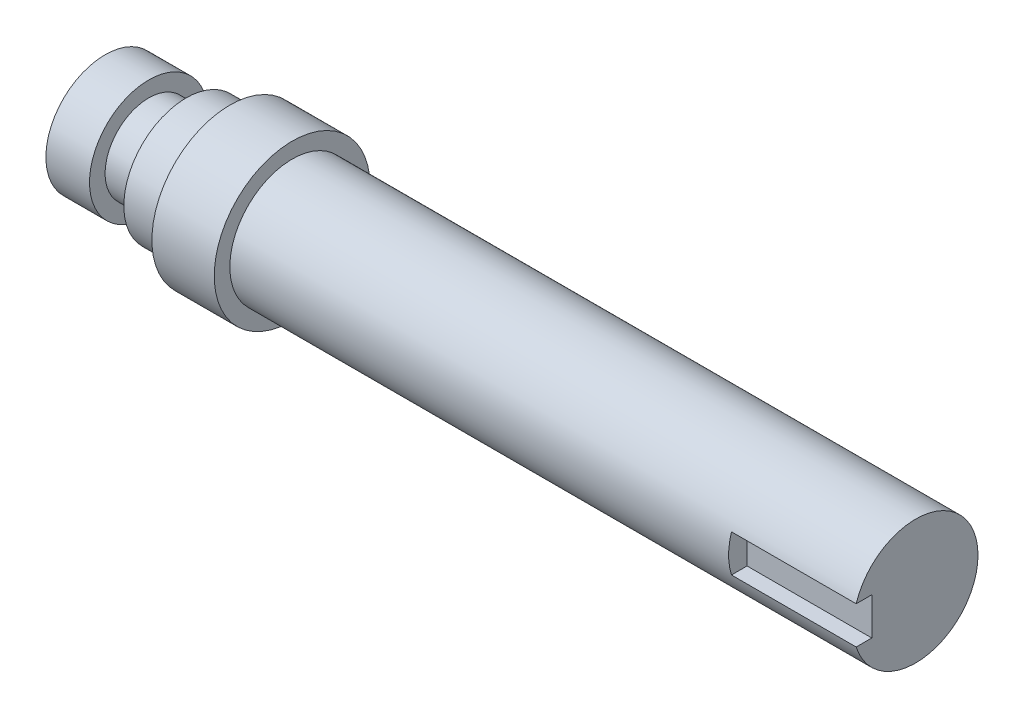
ISO-10303-21;
HEADER;
FILE_DESCRIPTION(('STEP AP214'),'2;1');
FILE_NAME('part.step','',(''),(''),'','','');
FILE_SCHEMA(('AUTOMOTIVE_DESIGN { 1 0 10303 214 1 1 1 1 }'));
ENDSEC;
DATA;
#1=APPLICATION_CONTEXT('core data for automotive mechanical design processes');
#2=APPLICATION_PROTOCOL_DEFINITION('international standard','automotive_design',2000,#1);
#3=PRODUCT_CONTEXT('',#1,'mechanical');
#4=PRODUCT('Part','Part','',(#3));
#5=PRODUCT_RELATED_PRODUCT_CATEGORY('part','',(#4));
#6=PRODUCT_DEFINITION_FORMATION('','',#4);
#7=PRODUCT_DEFINITION_CONTEXT('part definition',#1,'design');
#8=PRODUCT_DEFINITION('design','',#6,#7);
#9=PRODUCT_DEFINITION_SHAPE('','',#8);
#10=(LENGTH_UNIT() NAMED_UNIT(*) SI_UNIT(.MILLI.,.METRE.));
#11=(NAMED_UNIT(*) PLANE_ANGLE_UNIT() SI_UNIT($,.RADIAN.));
#12=(NAMED_UNIT(*) SI_UNIT($,.STERADIAN.) SOLID_ANGLE_UNIT());
#13=UNCERTAINTY_MEASURE_WITH_UNIT(LENGTH_MEASURE(1.E-05),#10,'distance_accuracy_value','');
#14=(GEOMETRIC_REPRESENTATION_CONTEXT(3) GLOBAL_UNCERTAINTY_ASSIGNED_CONTEXT((#13)) GLOBAL_UNIT_ASSIGNED_CONTEXT((#10,
#11,#12)) REPRESENTATION_CONTEXT('',''));
#15=CARTESIAN_POINT('',(0.,0.,0.));
#16=DIRECTION('',(0.,0.,1.));
#17=DIRECTION('',(1.,0.,0.));
#18=AXIS2_PLACEMENT_3D('',#15,#16,#17);
#19=CARTESIAN_POINT('',(0.,0.,0.));
#20=DIRECTION('',(-1.,0.,0.));
#21=DIRECTION('',(0.,0.,1.));
#22=AXIS2_PLACEMENT_3D('',#19,#20,#21);
#23=PLANE('',#22);
#24=CARTESIAN_POINT('',(0.,0.,0.));
#25=DIRECTION('',(1.,0.,0.));
#26=DIRECTION('',(0.,0.,-1.));
#27=AXIS2_PLACEMENT_3D('',#24,#25,#26);
#28=CIRCLE('',#27,9.5);
#29=CARTESIAN_POINT('',(0.,0.,-9.5));
#30=VERTEX_POINT('',#29);
#31=EDGE_CURVE('E11',#30,#30,#28,.T.);
#32=ORIENTED_EDGE('',*,*,#31,.F.);
#33=EDGE_LOOP('',(#32));
#34=FACE_BOUND('',#33,.T.);
#35=ADVANCED_FACE('F45',(#34),#23,.T.);
#36=CARTESIAN_POINT('',(130.,0.,0.));
#37=DIRECTION('',(1.,0.,0.));
#38=DIRECTION('',(0.,0.,-1.));
#39=AXIS2_PLACEMENT_3D('',#36,#37,#38);
#40=CYLINDRICAL_SURFACE('',#39,9.5);
#41=ORIENTED_EDGE('',*,*,#31,.T.);
#42=EDGE_LOOP('',(#41));
#43=FACE_BOUND('',#42,.T.);
#44=CARTESIAN_POINT('',(7.00000000000001,0.,0.));
#45=DIRECTION('',(1.,0.,0.));
#46=DIRECTION('',(0.,0.,-1.));
#47=AXIS2_PLACEMENT_3D('',#44,#45,#46);
#48=CIRCLE('',#47,9.5);
#49=CARTESIAN_POINT('',(7.00000000000001,0.,-9.5));
#50=VERTEX_POINT('',#49);
#51=EDGE_CURVE('E53',#50,#50,#48,.T.);
#52=ORIENTED_EDGE('',*,*,#51,.F.);
#53=EDGE_LOOP('',(#52));
#54=FACE_BOUND('',#53,.T.);
#55=ADVANCED_FACE('F168',(#43,#54),#40,.T.);
#56=CARTESIAN_POINT('',(7.,9.5,0.));
#57=DIRECTION('',(1.,0.,0.));
#58=DIRECTION('',(0.,0.,-1.));
#59=AXIS2_PLACEMENT_3D('',#56,#57,#58);
#60=PLANE('',#59);
#61=ORIENTED_EDGE('',*,*,#51,.T.);
#62=EDGE_LOOP('',(#61));
#63=FACE_BOUND('',#62,.T.);
#64=CARTESIAN_POINT('',(7.00000000000001,0.,0.));
#65=DIRECTION('',(1.,0.,0.));
#66=DIRECTION('',(0.,0.,-1.));
#67=AXIS2_PLACEMENT_3D('',#64,#65,#66);
#68=CIRCLE('',#67,7.);
#69=CARTESIAN_POINT('',(7.00000000000001,0.,-7.));
#70=VERTEX_POINT('',#69);
#71=EDGE_CURVE('E158',#70,#70,#68,.T.);
#72=ORIENTED_EDGE('',*,*,#71,.F.);
#73=EDGE_LOOP('',(#72));
#74=FACE_BOUND('',#73,.T.);
#75=ADVANCED_FACE('F165',(#63,#74),#60,.T.);
#76=CARTESIAN_POINT('',(130.,0.,0.));
#77=DIRECTION('',(1.,0.,0.));
#78=DIRECTION('',(0.,0.,-1.));
#79=AXIS2_PLACEMENT_3D('',#76,#77,#78);
#80=CYLINDRICAL_SURFACE('',#79,7.);
#81=ORIENTED_EDGE('',*,*,#71,.T.);
#82=EDGE_LOOP('',(#81));
#83=FACE_BOUND('',#82,.T.);
#84=CARTESIAN_POINT('',(13.,0.,0.));
#85=DIRECTION('',(1.,0.,0.));
#86=DIRECTION('',(0.,0.,-1.));
#87=AXIS2_PLACEMENT_3D('',#84,#85,#86);
#88=CIRCLE('',#87,7.);
#89=CARTESIAN_POINT('',(13.,0.,-7.));
#90=VERTEX_POINT('',#89);
#91=EDGE_CURVE('E154',#90,#90,#88,.T.);
#92=ORIENTED_EDGE('',*,*,#91,.F.);
#93=EDGE_LOOP('',(#92));
#94=FACE_BOUND('',#93,.T.);
#95=ADVANCED_FACE('F175',(#83,#94),#80,.T.);
#96=CARTESIAN_POINT('',(13.,7.,0.));
#97=DIRECTION('',(-1.,0.,0.));
#98=DIRECTION('',(0.,0.,1.));
#99=AXIS2_PLACEMENT_3D('',#96,#97,#98);
#100=PLANE('',#99);
#101=ORIENTED_EDGE('',*,*,#91,.T.);
#102=EDGE_LOOP('',(#101));
#103=FACE_BOUND('',#102,.T.);
#104=CARTESIAN_POINT('',(13.,0.,0.));
#105=DIRECTION('',(1.,0.,0.));
#106=DIRECTION('',(0.,0.,-1.));
#107=AXIS2_PLACEMENT_3D('',#104,#105,#106);
#108=CIRCLE('',#107,10.);
#109=CARTESIAN_POINT('',(13.,0.,-10.));
#110=VERTEX_POINT('',#109);
#111=EDGE_CURVE('E150',#110,#110,#108,.T.);
#112=ORIENTED_EDGE('',*,*,#111,.F.);
#113=EDGE_LOOP('',(#112));
#114=FACE_BOUND('',#113,.T.);
#115=ADVANCED_FACE('F181',(#103,#114),#100,.T.);
#116=CARTESIAN_POINT('',(130.,0.,0.));
#117=DIRECTION('',(1.,0.,0.));
#118=DIRECTION('',(0.,0.,-1.));
#119=AXIS2_PLACEMENT_3D('',#116,#117,#118);
#120=CYLINDRICAL_SURFACE('',#119,10.);
#121=ORIENTED_EDGE('',*,*,#111,.T.);
#122=EDGE_LOOP('',(#121));
#123=FACE_BOUND('',#122,.T.);
#124=CARTESIAN_POINT('',(20.,0.,0.));
#125=DIRECTION('',(1.,0.,0.));
#126=DIRECTION('',(0.,0.,-1.));
#127=AXIS2_PLACEMENT_3D('',#124,#125,#126);
#128=CIRCLE('',#127,10.);
#129=CARTESIAN_POINT('',(20.,0.,-10.));
#130=VERTEX_POINT('',#129);
#131=EDGE_CURVE('E146',#130,#130,#128,.T.);
#132=ORIENTED_EDGE('',*,*,#131,.F.);
#133=EDGE_LOOP('',(#132));
#134=FACE_BOUND('',#133,.T.);
#135=ADVANCED_FACE('F185',(#123,#134),#120,.T.);
#136=CARTESIAN_POINT('',(20.,10.,0.));
#137=DIRECTION('',(-1.,0.,0.));
#138=DIRECTION('',(0.,0.,1.));
#139=AXIS2_PLACEMENT_3D('',#136,#137,#138);
#140=PLANE('',#139);
#141=ORIENTED_EDGE('',*,*,#131,.T.);
#142=EDGE_LOOP('',(#141));
#143=FACE_BOUND('',#142,.T.);
#144=CARTESIAN_POINT('',(20.,0.,0.));
#145=DIRECTION('',(1.,0.,0.));
#146=DIRECTION('',(0.,0.,-1.));
#147=AXIS2_PLACEMENT_3D('',#144,#145,#146);
#148=CIRCLE('',#147,12.5);
#149=CARTESIAN_POINT('',(20.,0.,-12.5));
#150=VERTEX_POINT('',#149);
#151=EDGE_CURVE('E142',#150,#150,#148,.T.);
#152=ORIENTED_EDGE('',*,*,#151,.F.);
#153=EDGE_LOOP('',(#152));
#154=FACE_BOUND('',#153,.T.);
#155=ADVANCED_FACE('F189',(#143,#154),#140,.T.);
#156=CARTESIAN_POINT('',(130.,0.,0.));
#157=DIRECTION('',(1.,0.,0.));
#158=DIRECTION('',(0.,0.,-1.));
#159=AXIS2_PLACEMENT_3D('',#156,#157,#158);
#160=CYLINDRICAL_SURFACE('',#159,12.5);
#161=ORIENTED_EDGE('',*,*,#151,.T.);
#162=EDGE_LOOP('',(#161));
#163=FACE_BOUND('',#162,.T.);
#164=CARTESIAN_POINT('',(30.,0.,0.));
#165=DIRECTION('',(1.,0.,0.));
#166=DIRECTION('',(0.,0.,-1.));
#167=AXIS2_PLACEMENT_3D('',#164,#165,#166);
#168=CIRCLE('',#167,12.5);
#169=CARTESIAN_POINT('',(30.,0.,-12.5));
#170=VERTEX_POINT('',#169);
#171=EDGE_CURVE('E138',#170,#170,#168,.T.);
#172=ORIENTED_EDGE('',*,*,#171,.F.);
#173=EDGE_LOOP('',(#172));
#174=FACE_BOUND('',#173,.T.);
#175=ADVANCED_FACE('F193',(#163,#174),#160,.T.);
#176=CARTESIAN_POINT('',(30.,12.5,0.));
#177=DIRECTION('',(1.,0.,0.));
#178=DIRECTION('',(0.,0.,-1.));
#179=AXIS2_PLACEMENT_3D('',#176,#177,#178);
#180=PLANE('',#179);
#181=ORIENTED_EDGE('',*,*,#171,.T.);
#182=EDGE_LOOP('',(#181));
#183=FACE_BOUND('',#182,.T.);
#184=CARTESIAN_POINT('',(30.,0.,0.));
#185=DIRECTION('',(1.,0.,0.));
#186=DIRECTION('',(0.,0.,-1.));
#187=AXIS2_PLACEMENT_3D('',#184,#185,#186);
#188=CIRCLE('',#187,10.);
#189=CARTESIAN_POINT('',(30.,0.,-10.));
#190=VERTEX_POINT('',#189);
#191=EDGE_CURVE('E134',#190,#190,#188,.T.);
#192=ORIENTED_EDGE('',*,*,#191,.F.);
#193=EDGE_LOOP('',(#192));
#194=FACE_BOUND('',#193,.T.);
#195=ADVANCED_FACE('F197',(#183,#194),#180,.T.);
#196=CARTESIAN_POINT('',(130.,0.,0.));
#197=DIRECTION('',(1.,0.,0.));
#198=DIRECTION('',(0.,0.,-1.));
#199=AXIS2_PLACEMENT_3D('',#196,#197,#198);
#200=CYLINDRICAL_SURFACE('',#199,10.);
#201=DIRECTION('',(1.,0.,0.));
#202=VECTOR('',#201,1.);
#203=CARTESIAN_POINT('',(110.,3.,9.53939201416946));
#204=LINE('',#203,#202);
#205=CARTESIAN_POINT('',(110.,3.,9.53939201416946));
#206=VERTEX_POINT('',#205);
#207=CARTESIAN_POINT('',(130.,3.,9.53939201416946));
#208=VERTEX_POINT('',#207);
#209=EDGE_CURVE('E69',#206,#208,#204,.T.);
#210=ORIENTED_EDGE('',*,*,#209,.T.);
#211=CARTESIAN_POINT('',(130.,0.,0.));
#212=DIRECTION('',(1.,0.,0.));
#213=DIRECTION('',(0.,0.,-1.));
#214=AXIS2_PLACEMENT_3D('',#211,#212,#213);
#215=CIRCLE('',#214,10.);
#216=CARTESIAN_POINT('',(130.,-3.,9.53939201416946));
#217=VERTEX_POINT('',#216);
#218=EDGE_CURVE('E126',#217,#208,#215,.T.);
#219=ORIENTED_EDGE('',*,*,#218,.F.);
#220=DIRECTION('',(1.,0.,0.));
#221=VECTOR('',#220,1.);
#222=CARTESIAN_POINT('',(110.,-3.,9.53939201416946));
#223=LINE('',#222,#221);
#224=CARTESIAN_POINT('',(110.,-3.,9.53939201416946));
#225=VERTEX_POINT('',#224);
#226=EDGE_CURVE('E60',#225,#217,#223,.T.);
#227=ORIENTED_EDGE('',*,*,#226,.F.);
#228=CARTESIAN_POINT('',(110.,0.,0.));
#229=DIRECTION('',(1.,0.,0.));
#230=DIRECTION('',(0.,0.,-1.));
#231=AXIS2_PLACEMENT_3D('',#228,#229,#230);
#232=CIRCLE('',#231,10.);
#233=EDGE_CURVE('E109',#206,#225,#232,.T.);
#234=ORIENTED_EDGE('',*,*,#233,.F.);
#235=EDGE_LOOP('',(#210,#219,#227,#234));
#236=FACE_BOUND('',#235,.T.);
#237=ORIENTED_EDGE('',*,*,#191,.T.);
#238=EDGE_LOOP('',(#237));
#239=FACE_BOUND('',#238,.T.);
#240=ADVANCED_FACE('F201',(#236,#239),#200,.T.);
#241=CARTESIAN_POINT('',(130.,10.,0.));
#242=DIRECTION('',(1.,0.,0.));
#243=DIRECTION('',(0.,0.,-1.));
#244=AXIS2_PLACEMENT_3D('',#241,#242,#243);
#245=PLANE('',#244);
#246=DIRECTION('',(0.,0.,1.));
#247=VECTOR('',#246,1.);
#248=CARTESIAN_POINT('',(130.,3.,9.53939201416946));
#249=LINE('',#248,#247);
#250=CARTESIAN_POINT('',(130.,3.,7.03939201416946));
#251=VERTEX_POINT('',#250);
#252=EDGE_CURVE('E84',#251,#208,#249,.T.);
#253=ORIENTED_EDGE('',*,*,#252,.F.);
#254=DIRECTION('',(0.,1.,0.));
#255=VECTOR('',#254,1.);
#256=CARTESIAN_POINT('',(130.,3.,7.03939201416946));
#257=LINE('',#256,#255);
#258=CARTESIAN_POINT('',(130.,-3.,7.03939201416946));
#259=VERTEX_POINT('',#258);
#260=EDGE_CURVE('E119',#259,#251,#257,.T.);
#261=ORIENTED_EDGE('',*,*,#260,.F.);
#262=DIRECTION('',(0.,0.,-1.));
#263=VECTOR('',#262,1.);
#264=CARTESIAN_POINT('',(130.,-3.,9.53939201416946));
#265=LINE('',#264,#263);
#266=EDGE_CURVE('E93',#217,#259,#265,.T.);
#267=ORIENTED_EDGE('',*,*,#266,.F.);
#268=ORIENTED_EDGE('',*,*,#218,.T.);
#269=EDGE_LOOP('',(#253,#261,#267,#268));
#270=FACE_BOUND('',#269,.T.);
#271=ADVANCED_FACE('F205',(#270),#245,.T.);
#272=CARTESIAN_POINT('',(110.,3.,9.53939201416946));
#273=DIRECTION('',(0.,1.,0.));
#274=DIRECTION('',(0.,0.,1.));
#275=AXIS2_PLACEMENT_3D('',#272,#273,#274);
#276=PLANE('',#275);
#277=ORIENTED_EDGE('',*,*,#252,.T.);
#278=ORIENTED_EDGE('',*,*,#209,.F.);
#279=DIRECTION('',(0.,0.,1.));
#280=VECTOR('',#279,1.);
#281=CARTESIAN_POINT('',(110.,3.,9.53939201416946));
#282=LINE('',#281,#280);
#283=CARTESIAN_POINT('',(110.,3.,7.03939201416946));
#284=VERTEX_POINT('',#283);
#285=EDGE_CURVE('E105',#284,#206,#282,.T.);
#286=ORIENTED_EDGE('',*,*,#285,.F.);
#287=DIRECTION('',(1.,0.,0.));
#288=VECTOR('',#287,1.);
#289=CARTESIAN_POINT('',(110.,3.,7.03939201416946));
#290=LINE('',#289,#288);
#291=EDGE_CURVE('E98',#284,#251,#290,.T.);
#292=ORIENTED_EDGE('',*,*,#291,.T.);
#293=EDGE_LOOP('',(#277,#278,#286,#292));
#294=FACE_BOUND('',#293,.T.);
#295=ADVANCED_FACE('F209',(#294),#276,.F.);
#296=CARTESIAN_POINT('',(110.,3.,7.03939201416946));
#297=DIRECTION('',(0.,0.,-1.));
#298=DIRECTION('',(0.,1.,0.));
#299=AXIS2_PLACEMENT_3D('',#296,#297,#298);
#300=PLANE('',#299);
#301=ORIENTED_EDGE('',*,*,#260,.T.);
#302=ORIENTED_EDGE('',*,*,#291,.F.);
#303=DIRECTION('',(0.,1.,0.));
#304=VECTOR('',#303,1.);
#305=CARTESIAN_POINT('',(110.,3.,7.03939201416946));
#306=LINE('',#305,#304);
#307=CARTESIAN_POINT('',(110.,-3.,7.03939201416946));
#308=VERTEX_POINT('',#307);
#309=EDGE_CURVE('E101',#308,#284,#306,.T.);
#310=ORIENTED_EDGE('',*,*,#309,.F.);
#311=DIRECTION('',(1.,0.,0.));
#312=VECTOR('',#311,1.);
#313=CARTESIAN_POINT('',(110.,-3.,7.03939201416946));
#314=LINE('',#313,#312);
#315=EDGE_CURVE('E90',#308,#259,#314,.T.);
#316=ORIENTED_EDGE('',*,*,#315,.T.);
#317=EDGE_LOOP('',(#301,#302,#310,#316));
#318=FACE_BOUND('',#317,.T.);
#319=ADVANCED_FACE('F102',(#318),#300,.F.);
#320=CARTESIAN_POINT('',(110.,-3.,9.53939201416946));
#321=DIRECTION('',(0.,-1.,0.));
#322=DIRECTION('',(0.,0.,-1.));
#323=AXIS2_PLACEMENT_3D('',#320,#321,#322);
#324=PLANE('',#323);
#325=ORIENTED_EDGE('',*,*,#266,.T.);
#326=ORIENTED_EDGE('',*,*,#315,.F.);
#327=DIRECTION('',(0.,0.,-1.));
#328=VECTOR('',#327,1.);
#329=CARTESIAN_POINT('',(110.,-3.,9.53939201416946));
#330=LINE('',#329,#328);
#331=EDGE_CURVE('E88',#225,#308,#330,.T.);
#332=ORIENTED_EDGE('',*,*,#331,.F.);
#333=ORIENTED_EDGE('',*,*,#226,.T.);
#334=EDGE_LOOP('',(#325,#326,#332,#333));
#335=FACE_BOUND('',#334,.T.);
#336=ADVANCED_FACE('F92',(#335),#324,.F.);
#337=CARTESIAN_POINT('',(110.,0.,0.));
#338=DIRECTION('',(1.,0.,0.));
#339=DIRECTION('',(0.,0.,-1.));
#340=AXIS2_PLACEMENT_3D('',#337,#338,#339);
#341=PLANE('',#340);
#342=ORIENTED_EDGE('',*,*,#233,.T.);
#343=ORIENTED_EDGE('',*,*,#331,.T.);
#344=ORIENTED_EDGE('',*,*,#309,.T.);
#345=ORIENTED_EDGE('',*,*,#285,.T.);
#346=EDGE_LOOP('',(#342,#343,#344,#345));
#347=FACE_BOUND('',#346,.T.);
#348=ADVANCED_FACE('F107',(#347),#341,.T.);
#349=CLOSED_SHELL('',(#35,#55,#75,#95,#115,#135,#155,#175,#195,#240,#271,#295,#319,#336,#348));
#350=MANIFOLD_SOLID_BREP('B2',#349);
#351=ADVANCED_BREP_SHAPE_REPRESENTATION('',(#18,#350),#14);
#352=SHAPE_DEFINITION_REPRESENTATION(#9,#351);
ENDSEC;
END-ISO-10303-21;
